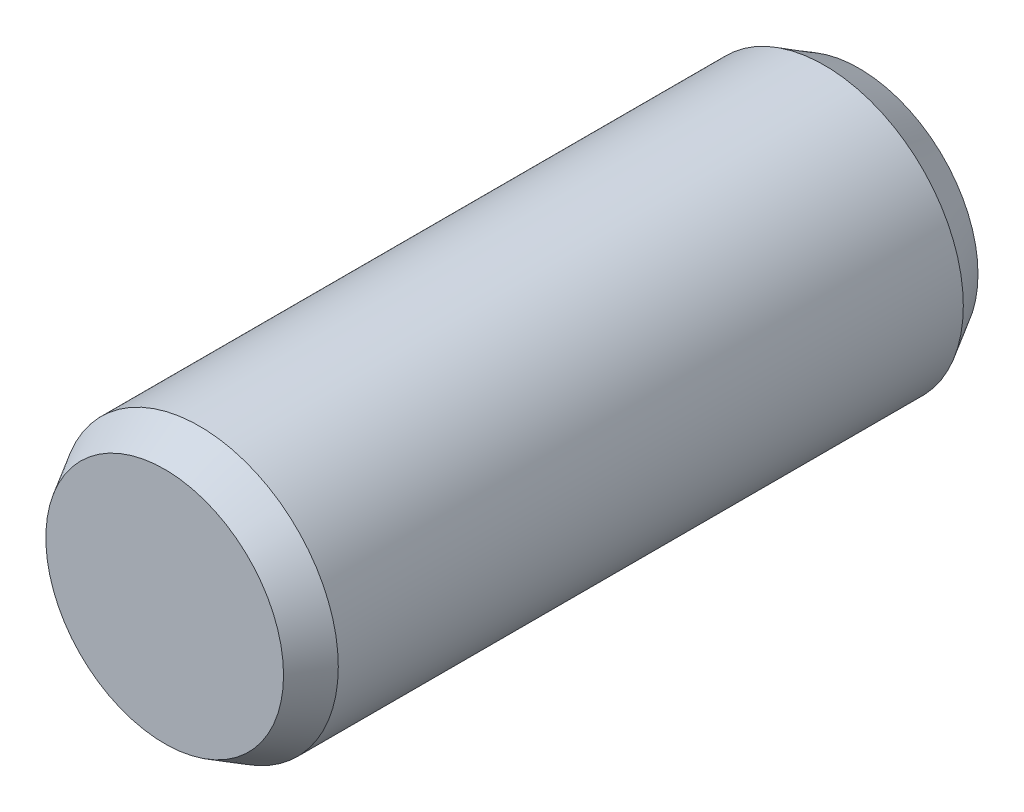
ISO-10303-21;
HEADER;
FILE_DESCRIPTION(('STEP AP214'),'2;1');
FILE_NAME('part.step','',(''),(''),'','','');
FILE_SCHEMA(('AUTOMOTIVE_DESIGN { 1 0 10303 214 1 1 1 1 }'));
ENDSEC;
DATA;
#1=APPLICATION_CONTEXT('core data for automotive mechanical design processes');
#2=APPLICATION_PROTOCOL_DEFINITION('international standard','automotive_design',2000,#1);
#3=PRODUCT_CONTEXT('',#1,'mechanical');
#4=PRODUCT('Part','Part','',(#3));
#5=PRODUCT_RELATED_PRODUCT_CATEGORY('part','',(#4));
#6=PRODUCT_DEFINITION_FORMATION('','',#4);
#7=PRODUCT_DEFINITION_CONTEXT('part definition',#1,'design');
#8=PRODUCT_DEFINITION('design','',#6,#7);
#9=PRODUCT_DEFINITION_SHAPE('','',#8);
#10=(LENGTH_UNIT() NAMED_UNIT(*) SI_UNIT(.MILLI.,.METRE.));
#11=(NAMED_UNIT(*) PLANE_ANGLE_UNIT() SI_UNIT($,.RADIAN.));
#12=(NAMED_UNIT(*) SI_UNIT($,.STERADIAN.) SOLID_ANGLE_UNIT());
#13=UNCERTAINTY_MEASURE_WITH_UNIT(LENGTH_MEASURE(1.E-05),#10,'distance_accuracy_value','');
#14=(GEOMETRIC_REPRESENTATION_CONTEXT(3) GLOBAL_UNCERTAINTY_ASSIGNED_CONTEXT((#13)) GLOBAL_UNIT_ASSIGNED_CONTEXT((#10,
#11,#12)) REPRESENTATION_CONTEXT('',''));
#15=CARTESIAN_POINT('',(0.,0.,0.));
#16=DIRECTION('',(0.,0.,1.));
#17=DIRECTION('',(1.,0.,0.));
#18=AXIS2_PLACEMENT_3D('',#15,#16,#17);
#19=CARTESIAN_POINT('',(0.,0.,10.));
#20=DIRECTION('',(0.,0.,-1.));
#21=DIRECTION('',(-1.,0.,0.));
#22=AXIS2_PLACEMENT_3D('',#19,#20,#21);
#23=CYLINDRICAL_SURFACE('',#22,2.);
#24=CARTESIAN_POINT('',(0.,0.,0.5));
#25=DIRECTION('',(0.,0.,1.));
#26=DIRECTION('',(1.,0.,0.));
#27=AXIS2_PLACEMENT_3D('',#24,#25,#26);
#28=CIRCLE('',#27,2.);
#29=CARTESIAN_POINT('',(2.,0.,0.5));
#30=VERTEX_POINT('',#29);
#31=EDGE_CURVE('E50',#30,#30,#28,.T.);
#32=ORIENTED_EDGE('',*,*,#31,.T.);
#33=EDGE_LOOP('',(#32));
#34=FACE_BOUND('',#33,.T.);
#35=CARTESIAN_POINT('',(0.,0.,9.5));
#36=DIRECTION('',(0.,0.,1.));
#37=DIRECTION('',(1.,0.,0.));
#38=AXIS2_PLACEMENT_3D('',#35,#36,#37);
#39=CIRCLE('',#38,2.);
#40=CARTESIAN_POINT('',(2.,0.,9.5));
#41=VERTEX_POINT('',#40);
#42=EDGE_CURVE('E54',#41,#41,#39,.F.);
#43=ORIENTED_EDGE('',*,*,#42,.T.);
#44=EDGE_LOOP('',(#43));
#45=FACE_BOUND('',#44,.T.);
#46=ADVANCED_FACE('F39',(#34,#45),#23,.T.);
#47=CARTESIAN_POINT('',(0.,0.,10.));
#48=DIRECTION('',(0.,0.,1.));
#49=DIRECTION('',(1.,0.,0.));
#50=AXIS2_PLACEMENT_3D('',#47,#48,#49);
#51=PLANE('',#50);
#52=CARTESIAN_POINT('',(0.,0.,10.));
#53=DIRECTION('',(0.,0.,1.));
#54=DIRECTION('',(1.,0.,0.));
#55=AXIS2_PLACEMENT_3D('',#52,#53,#54);
#56=CIRCLE('',#55,1.71132486540519);
#57=CARTESIAN_POINT('',(1.71132486540519,0.,10.));
#58=VERTEX_POINT('',#57);
#59=EDGE_CURVE('E10',#58,#58,#56,.T.);
#60=ORIENTED_EDGE('',*,*,#59,.T.);
#61=EDGE_LOOP('',(#60));
#62=FACE_BOUND('',#61,.T.);
#63=ADVANCED_FACE('F70',(#62),#51,.T.);
#64=CARTESIAN_POINT('',(0.,0.,0.));
#65=DIRECTION('',(0.,0.,1.));
#66=DIRECTION('',(1.,0.,0.));
#67=AXIS2_PLACEMENT_3D('',#64,#65,#66);
#68=PLANE('',#67);
#69=CARTESIAN_POINT('',(0.,0.,0.));
#70=DIRECTION('',(0.,0.,1.));
#71=DIRECTION('',(1.,0.,0.));
#72=AXIS2_PLACEMENT_3D('',#69,#70,#71);
#73=CIRCLE('',#72,1.71132486540519);
#74=CARTESIAN_POINT('',(1.71132486540519,0.,0.));
#75=VERTEX_POINT('',#74);
#76=EDGE_CURVE('E46',#75,#75,#73,.F.);
#77=ORIENTED_EDGE('',*,*,#76,.T.);
#78=EDGE_LOOP('',(#77));
#79=FACE_BOUND('',#78,.T.);
#80=ADVANCED_FACE('F67',(#79),#68,.F.);
#81=CARTESIAN_POINT('',(0.,0.,0.5));
#82=DIRECTION('',(0.,0.,1.));
#83=DIRECTION('',(1.,0.,0.));
#84=AXIS2_PLACEMENT_3D('',#81,#82,#83);
#85=CONICAL_SURFACE('',#84,2.,0.523598775598298);
#86=ORIENTED_EDGE('',*,*,#76,.F.);
#87=EDGE_LOOP('',(#86));
#88=FACE_BOUND('',#87,.T.);
#89=ORIENTED_EDGE('',*,*,#31,.F.);
#90=EDGE_LOOP('',(#89));
#91=FACE_BOUND('',#90,.T.);
#92=ADVANCED_FACE('F63',(#88,#91),#85,.T.);
#93=CARTESIAN_POINT('',(0.,0.,10.));
#94=DIRECTION('',(0.,0.,-1.));
#95=DIRECTION('',(-1.,0.,0.));
#96=AXIS2_PLACEMENT_3D('',#93,#94,#95);
#97=CONICAL_SURFACE('',#96,1.71132486540519,0.523598775598298);
#98=ORIENTED_EDGE('',*,*,#42,.F.);
#99=EDGE_LOOP('',(#98));
#100=FACE_BOUND('',#99,.T.);
#101=ORIENTED_EDGE('',*,*,#59,.F.);
#102=EDGE_LOOP('',(#101));
#103=FACE_BOUND('',#102,.T.);
#104=ADVANCED_FACE('F41',(#100,#103),#97,.T.);
#105=CLOSED_SHELL('',(#46,#63,#80,#92,#104));
#106=MANIFOLD_SOLID_BREP('B2',#105);
#107=ADVANCED_BREP_SHAPE_REPRESENTATION('',(#18,#106),#14);
#108=SHAPE_DEFINITION_REPRESENTATION(#9,#107);
ENDSEC;
END-ISO-10303-21;
